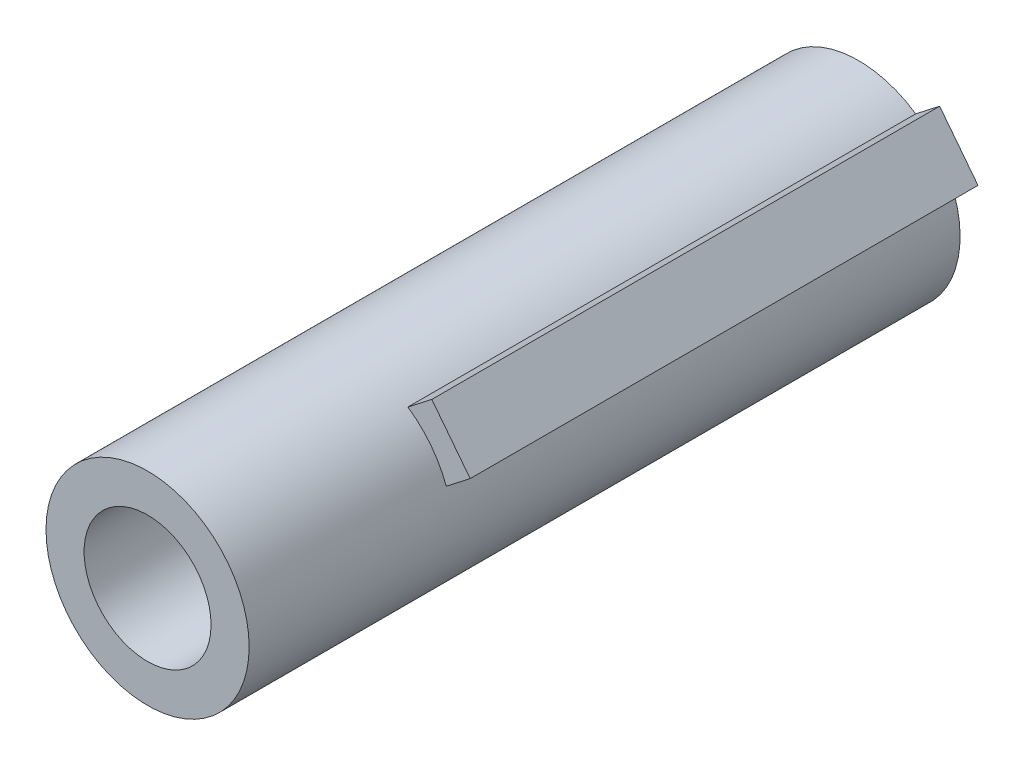
ISO-10303-21;
HEADER;
FILE_DESCRIPTION(('STEP AP214'),'2;1');
FILE_NAME('part.step','',(''),(''),'','','');
FILE_SCHEMA(('AUTOMOTIVE_DESIGN { 1 0 10303 214 1 1 1 1 }'));
ENDSEC;
DATA;
#1=APPLICATION_CONTEXT('core data for automotive mechanical design processes');
#2=APPLICATION_PROTOCOL_DEFINITION('international standard','automotive_design',2000,#1);
#3=PRODUCT_CONTEXT('',#1,'mechanical');
#4=PRODUCT('Part','Part','',(#3));
#5=PRODUCT_RELATED_PRODUCT_CATEGORY('part','',(#4));
#6=PRODUCT_DEFINITION_FORMATION('','',#4);
#7=PRODUCT_DEFINITION_CONTEXT('part definition',#1,'design');
#8=PRODUCT_DEFINITION('design','',#6,#7);
#9=PRODUCT_DEFINITION_SHAPE('','',#8);
#10=(LENGTH_UNIT() NAMED_UNIT(*) SI_UNIT(.MILLI.,.METRE.));
#11=(NAMED_UNIT(*) PLANE_ANGLE_UNIT() SI_UNIT($,.RADIAN.));
#12=(NAMED_UNIT(*) SI_UNIT($,.STERADIAN.) SOLID_ANGLE_UNIT());
#13=UNCERTAINTY_MEASURE_WITH_UNIT(LENGTH_MEASURE(1.E-05),#10,'distance_accuracy_value','');
#14=(GEOMETRIC_REPRESENTATION_CONTEXT(3) GLOBAL_UNCERTAINTY_ASSIGNED_CONTEXT((#13)) GLOBAL_UNIT_ASSIGNED_CONTEXT((#10,
#11,#12)) REPRESENTATION_CONTEXT('',''));
#15=CARTESIAN_POINT('',(0.,0.,0.));
#16=DIRECTION('',(0.,0.,1.));
#17=DIRECTION('',(1.,0.,0.));
#18=AXIS2_PLACEMENT_3D('',#15,#16,#17);
#19=CARTESIAN_POINT('',(3.19538691122736,4.03812573080036,20.));
#20=DIRECTION('',(-0.790078752683531,-0.613005354428521,0.));
#21=DIRECTION('',(0.613005354428521,-0.790078752683531,0.));
#22=AXIS2_PLACEMENT_3D('',#19,#20,#21);
#23=PLANE('',#22);
#24=DIRECTION('',(-0.613005354428521,0.79007875268353,0.));
#25=VECTOR('',#24,1.);
#26=CARTESIAN_POINT('',(3.19538691122736,4.03812573080036,0.));
#27=LINE('',#26,#25);
#28=CARTESIAN_POINT('',(4.70540061560795,2.09192781348484,0.));
#29=VERTEX_POINT('',#28);
#30=CARTESIAN_POINT('',(3.19538691122736,4.03812573080036,0.));
#31=VERTEX_POINT('',#30);
#32=EDGE_CURVE('E98',#29,#31,#27,.T.);
#33=ORIENTED_EDGE('',*,*,#32,.T.);
#34=DIRECTION('',(0.,0.,-1.));
#35=VECTOR('',#34,1.);
#36=CARTESIAN_POINT('',(3.19538691122736,4.03812573080036,20.));
#37=LINE('',#36,#35);
#38=CARTESIAN_POINT('',(3.19538691122736,4.03812573080036,20.));
#39=VERTEX_POINT('',#38);
#40=EDGE_CURVE('E11',#39,#31,#37,.T.);
#41=ORIENTED_EDGE('',*,*,#40,.F.);
#42=DIRECTION('',(-0.613005354428521,0.79007875268353,0.));
#43=VECTOR('',#42,1.);
#44=CARTESIAN_POINT('',(3.19538691122736,4.03812573080036,20.));
#45=LINE('',#44,#43);
#46=CARTESIAN_POINT('',(4.70540061560795,2.09192781348484,20.));
#47=VERTEX_POINT('',#46);
#48=EDGE_CURVE('E105',#47,#39,#45,.T.);
#49=ORIENTED_EDGE('',*,*,#48,.F.);
#50=DIRECTION('',(0.,0.,-1.));
#51=VECTOR('',#50,1.);
#52=CARTESIAN_POINT('',(4.70540061560795,2.09192781348484,20.));
#53=LINE('',#52,#51);
#54=EDGE_CURVE('E85',#47,#29,#53,.T.);
#55=ORIENTED_EDGE('',*,*,#54,.T.);
#56=EDGE_LOOP('',(#33,#41,#49,#55));
#57=FACE_BOUND('',#56,.T.);
#58=ADVANCED_FACE('F36',(#57),#23,.F.);
#59=CARTESIAN_POINT('',(3.19538691122736,4.03812573080036,20.));
#60=DIRECTION('',(0.613005354428521,-0.79007875268353,0.));
#61=DIRECTION('',(0.79007875268353,0.613005354428521,0.));
#62=AXIS2_PLACEMENT_3D('',#59,#60,#61);
#63=PLANE('',#62);
#64=DIRECTION('',(-0.79007875268353,-0.613005354428521,0.));
#65=VECTOR('',#64,1.);
#66=CARTESIAN_POINT('',(3.19538691122736,4.03812573080036,0.));
#67=LINE('',#66,#65);
#68=CARTESIAN_POINT('',(2.25176373828225,3.30598851585379,0.));
#69=VERTEX_POINT('',#68);
#70=EDGE_CURVE('E110',#31,#69,#67,.T.);
#71=ORIENTED_EDGE('',*,*,#70,.T.);
#72=DIRECTION('',(0.,0.,-1.));
#73=VECTOR('',#72,1.);
#74=CARTESIAN_POINT('',(2.25176373828225,3.30598851585379,20.));
#75=LINE('',#74,#73);
#76=CARTESIAN_POINT('',(2.25176373828225,3.30598851585379,20.));
#77=VERTEX_POINT('',#76);
#78=EDGE_CURVE('E44',#77,#69,#75,.T.);
#79=ORIENTED_EDGE('',*,*,#78,.F.);
#80=DIRECTION('',(-0.79007875268353,-0.613005354428521,0.));
#81=VECTOR('',#80,1.);
#82=CARTESIAN_POINT('',(3.19538691122736,4.03812573080036,20.));
#83=LINE('',#82,#81);
#84=EDGE_CURVE('E81',#39,#77,#83,.T.);
#85=ORIENTED_EDGE('',*,*,#84,.F.);
#86=ORIENTED_EDGE('',*,*,#40,.T.);
#87=EDGE_LOOP('',(#71,#79,#85,#86));
#88=FACE_BOUND('',#87,.T.);
#89=ADVANCED_FACE('F119',(#88),#63,.F.);
#90=CARTESIAN_POINT('',(0.,0.,20.));
#91=DIRECTION('',(0.,0.,-1.));
#92=DIRECTION('',(-1.,0.,0.));
#93=AXIS2_PLACEMENT_3D('',#90,#91,#92);
#94=CYLINDRICAL_SURFACE('',#93,4.);
#95=CARTESIAN_POINT('',(0.,0.,0.));
#96=DIRECTION('',(0.,0.,1.));
#97=DIRECTION('',(1.,0.,0.));
#98=AXIS2_PLACEMENT_3D('',#95,#96,#97);
#99=CIRCLE('',#98,4.);
#100=CARTESIAN_POINT('',(3.76177744266284,1.35979059853827,0.));
#101=VERTEX_POINT('',#100);
#102=EDGE_CURVE('E71',#69,#101,#99,.T.);
#103=ORIENTED_EDGE('',*,*,#102,.T.);
#104=DIRECTION('',(0.,0.,-1.));
#105=VECTOR('',#104,1.);
#106=CARTESIAN_POINT('',(3.76177744266284,1.35979059853827,20.));
#107=LINE('',#106,#105);
#108=CARTESIAN_POINT('',(3.76177744266284,1.35979059853827,20.));
#109=VERTEX_POINT('',#108);
#110=EDGE_CURVE('E84',#109,#101,#107,.T.);
#111=ORIENTED_EDGE('',*,*,#110,.F.);
#112=CARTESIAN_POINT('',(0.,0.,20.));
#113=DIRECTION('',(0.,0.,1.));
#114=DIRECTION('',(1.,0.,0.));
#115=AXIS2_PLACEMENT_3D('',#112,#113,#114);
#116=CIRCLE('',#115,4.);
#117=EDGE_CURVE('E91',#109,#77,#116,.T.);
#118=ORIENTED_EDGE('',*,*,#117,.T.);
#119=ORIENTED_EDGE('',*,*,#78,.T.);
#120=EDGE_LOOP('',(#103,#111,#118,#119));
#121=FACE_BOUND('',#120,.T.);
#122=CARTESIAN_POINT('',(0.,0.,28.));
#123=DIRECTION('',(0.,0.,1.));
#124=DIRECTION('',(1.,0.,0.));
#125=AXIS2_PLACEMENT_3D('',#122,#123,#124);
#126=CIRCLE('',#125,4.);
#127=CARTESIAN_POINT('',(4.,0.,28.));
#128=VERTEX_POINT('',#127);
#129=EDGE_CURVE('E94',#128,#128,#126,.T.);
#130=ORIENTED_EDGE('',*,*,#129,.F.);
#131=EDGE_LOOP('',(#130));
#132=FACE_BOUND('',#131,.T.);
#133=ADVANCED_FACE('F89',(#121,#132),#94,.T.);
#134=CARTESIAN_POINT('',(4.70540061560795,2.09192781348484,20.));
#135=DIRECTION('',(-0.61300535442852,0.790078752683531,0.));
#136=DIRECTION('',(-0.790078752683531,-0.61300535442852,0.));
#137=AXIS2_PLACEMENT_3D('',#134,#135,#136);
#138=PLANE('',#137);
#139=DIRECTION('',(0.790078752683531,0.61300535442852,0.));
#140=VECTOR('',#139,1.);
#141=CARTESIAN_POINT('',(4.70540061560795,2.09192781348484,0.));
#142=LINE('',#141,#140);
#143=EDGE_CURVE('E76',#101,#29,#142,.T.);
#144=ORIENTED_EDGE('',*,*,#143,.T.);
#145=ORIENTED_EDGE('',*,*,#54,.F.);
#146=DIRECTION('',(0.790078752683531,0.61300535442852,0.));
#147=VECTOR('',#146,1.);
#148=CARTESIAN_POINT('',(4.70540061560795,2.09192781348484,20.));
#149=LINE('',#148,#147);
#150=EDGE_CURVE('E52',#109,#47,#149,.T.);
#151=ORIENTED_EDGE('',*,*,#150,.F.);
#152=ORIENTED_EDGE('',*,*,#110,.T.);
#153=EDGE_LOOP('',(#144,#145,#151,#152));
#154=FACE_BOUND('',#153,.T.);
#155=ADVANCED_FACE('F83',(#154),#138,.F.);
#156=CARTESIAN_POINT('',(0.,0.,20.));
#157=DIRECTION('',(0.,0.,1.));
#158=DIRECTION('',(1.,0.,0.));
#159=AXIS2_PLACEMENT_3D('',#156,#157,#158);
#160=PLANE('',#159);
#161=ORIENTED_EDGE('',*,*,#117,.F.);
#162=ORIENTED_EDGE('',*,*,#150,.T.);
#163=ORIENTED_EDGE('',*,*,#48,.T.);
#164=ORIENTED_EDGE('',*,*,#84,.T.);
#165=EDGE_LOOP('',(#161,#162,#163,#164));
#166=FACE_BOUND('',#165,.T.);
#167=ADVANCED_FACE('F93',(#166),#160,.T.);
#168=CARTESIAN_POINT('',(0.,0.,0.));
#169=DIRECTION('',(0.,0.,1.));
#170=DIRECTION('',(1.,0.,0.));
#171=AXIS2_PLACEMENT_3D('',#168,#169,#170);
#172=PLANE('',#171);
#173=ORIENTED_EDGE('',*,*,#32,.F.);
#174=ORIENTED_EDGE('',*,*,#143,.F.);
#175=ORIENTED_EDGE('',*,*,#102,.F.);
#176=ORIENTED_EDGE('',*,*,#70,.F.);
#177=EDGE_LOOP('',(#173,#174,#175,#176));
#178=FACE_BOUND('',#177,.T.);
#179=ADVANCED_FACE('F116',(#178),#172,.F.);
#180=CARTESIAN_POINT('',(0.,0.,28.));
#181=DIRECTION('',(0.,0.,1.));
#182=DIRECTION('',(1.,0.,0.));
#183=AXIS2_PLACEMENT_3D('',#180,#181,#182);
#184=PLANE('',#183);
#185=CARTESIAN_POINT('',(0.,0.,28.));
#186=DIRECTION('',(0.,0.,1.));
#187=DIRECTION('',(1.,0.,0.));
#188=AXIS2_PLACEMENT_3D('',#185,#186,#187);
#189=CIRCLE('',#188,2.5);
#190=CARTESIAN_POINT('',(2.5,0.,28.));
#191=VERTEX_POINT('',#190);
#192=EDGE_CURVE('E101',#191,#191,#189,.T.);
#193=ORIENTED_EDGE('',*,*,#192,.F.);
#194=EDGE_LOOP('',(#193));
#195=FACE_BOUND('',#194,.T.);
#196=ORIENTED_EDGE('',*,*,#129,.T.);
#197=EDGE_LOOP('',(#196));
#198=FACE_BOUND('',#197,.T.);
#199=ADVANCED_FACE('F131',(#195,#198),#184,.T.);
#200=CARTESIAN_POINT('',(0.,0.,8.));
#201=DIRECTION('',(0.,0.,1.));
#202=DIRECTION('',(1.,0.,0.));
#203=AXIS2_PLACEMENT_3D('',#200,#201,#202);
#204=CYLINDRICAL_SURFACE('',#203,2.5);
#205=CARTESIAN_POINT('',(0.,0.,8.));
#206=DIRECTION('',(0.,0.,1.));
#207=DIRECTION('',(1.,0.,0.));
#208=AXIS2_PLACEMENT_3D('',#205,#206,#207);
#209=CIRCLE('',#208,2.5);
#210=CARTESIAN_POINT('',(2.5,0.,8.));
#211=VERTEX_POINT('',#210);
#212=EDGE_CURVE('E95',#211,#211,#209,.T.);
#213=ORIENTED_EDGE('',*,*,#212,.F.);
#214=EDGE_LOOP('',(#213));
#215=FACE_BOUND('',#214,.T.);
#216=ORIENTED_EDGE('',*,*,#192,.T.);
#217=EDGE_LOOP('',(#216));
#218=FACE_BOUND('',#217,.T.);
#219=ADVANCED_FACE('F136',(#215,#218),#204,.F.);
#220=CARTESIAN_POINT('',(0.,0.,8.));
#221=DIRECTION('',(0.,0.,1.));
#222=DIRECTION('',(1.,0.,0.));
#223=AXIS2_PLACEMENT_3D('',#220,#221,#222);
#224=PLANE('',#223);
#225=ORIENTED_EDGE('',*,*,#212,.T.);
#226=EDGE_LOOP('',(#225));
#227=FACE_BOUND('',#226,.T.);
#228=ADVANCED_FACE('F140',(#227),#224,.T.);
#229=CLOSED_SHELL('',(#58,#89,#133,#155,#167,#179,#199,#219,#228));
#230=MANIFOLD_SOLID_BREP('B2',#229);
#231=ADVANCED_BREP_SHAPE_REPRESENTATION('',(#18,#230),#14);
#232=SHAPE_DEFINITION_REPRESENTATION(#9,#231);
ENDSEC;
END-ISO-10303-21;
